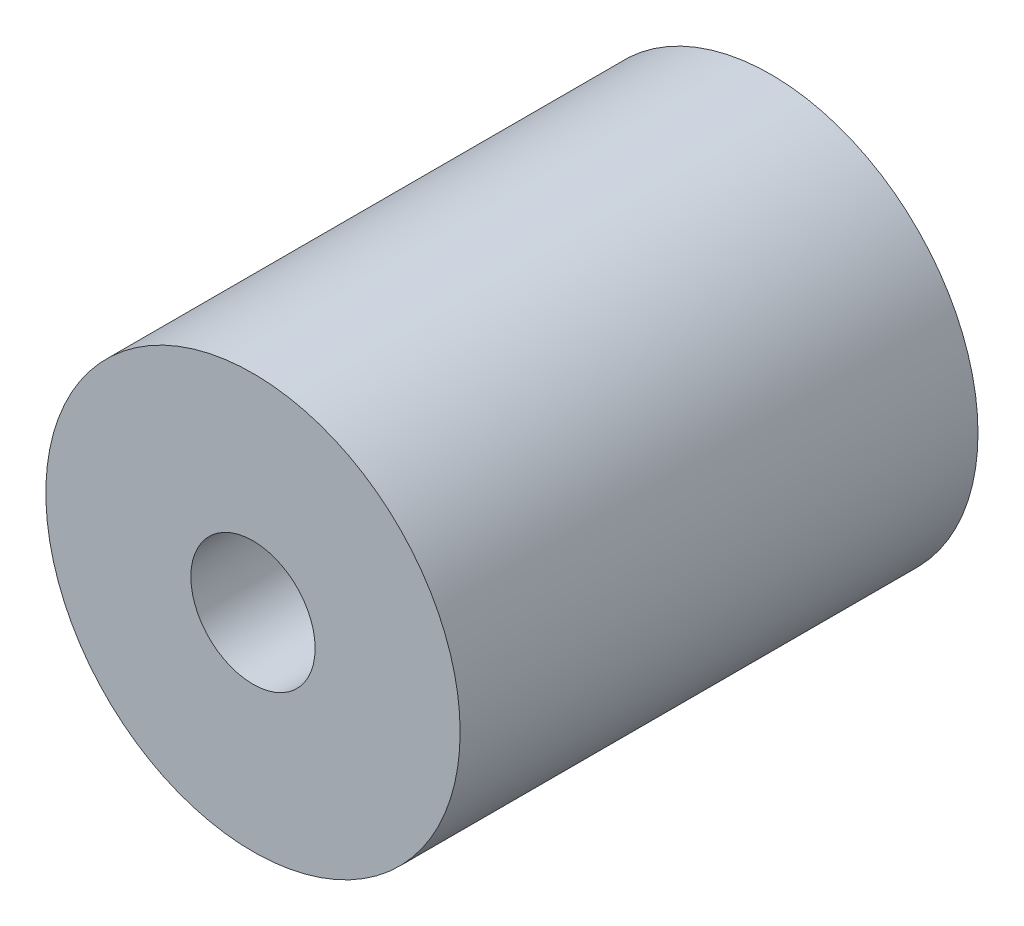
ISO-10303-21;
HEADER;
FILE_DESCRIPTION(('STEP AP214'),'2;1');
FILE_NAME('part.step','',(''),(''),'','','');
FILE_SCHEMA(('AUTOMOTIVE_DESIGN { 1 0 10303 214 1 1 1 1 }'));
ENDSEC;
DATA;
#1=APPLICATION_CONTEXT('core data for automotive mechanical design processes');
#2=APPLICATION_PROTOCOL_DEFINITION('international standard','automotive_design',2000,#1);
#3=PRODUCT_CONTEXT('',#1,'mechanical');
#4=PRODUCT('Part','Part','',(#3));
#5=PRODUCT_RELATED_PRODUCT_CATEGORY('part','',(#4));
#6=PRODUCT_DEFINITION_FORMATION('','',#4);
#7=PRODUCT_DEFINITION_CONTEXT('part definition',#1,'design');
#8=PRODUCT_DEFINITION('design','',#6,#7);
#9=PRODUCT_DEFINITION_SHAPE('','',#8);
#10=(LENGTH_UNIT() NAMED_UNIT(*) SI_UNIT(.MILLI.,.METRE.));
#11=(NAMED_UNIT(*) PLANE_ANGLE_UNIT() SI_UNIT($,.RADIAN.));
#12=(NAMED_UNIT(*) SI_UNIT($,.STERADIAN.) SOLID_ANGLE_UNIT());
#13=UNCERTAINTY_MEASURE_WITH_UNIT(LENGTH_MEASURE(1.E-05),#10,'distance_accuracy_value','');
#14=(GEOMETRIC_REPRESENTATION_CONTEXT(3) GLOBAL_UNCERTAINTY_ASSIGNED_CONTEXT((#13)) GLOBAL_UNIT_ASSIGNED_CONTEXT((#10,
#11,#12)) REPRESENTATION_CONTEXT('',''));
#15=CARTESIAN_POINT('',(0.,0.,0.));
#16=DIRECTION('',(0.,0.,1.));
#17=DIRECTION('',(1.,0.,0.));
#18=AXIS2_PLACEMENT_3D('',#15,#16,#17);
#19=CARTESIAN_POINT('',(0.,0.,25.));
#20=DIRECTION('',(0.,0.,-1.));
#21=DIRECTION('',(-1.,0.,0.));
#22=AXIS2_PLACEMENT_3D('',#19,#20,#21);
#23=CYLINDRICAL_SURFACE('',#22,3.);
#24=CARTESIAN_POINT('',(0.,0.,25.));
#25=DIRECTION('',(0.,0.,1.));
#26=DIRECTION('',(1.,0.,0.));
#27=AXIS2_PLACEMENT_3D('',#24,#25,#26);
#28=CIRCLE('',#27,3.);
#29=CARTESIAN_POINT('',(3.,0.,25.));
#30=VERTEX_POINT('',#29);
#31=EDGE_CURVE('E50',#30,#30,#28,.T.);
#32=ORIENTED_EDGE('',*,*,#31,.T.);
#33=EDGE_LOOP('',(#32));
#34=FACE_BOUND('',#33,.T.);
#35=CARTESIAN_POINT('',(0.,0.,10.));
#36=DIRECTION('',(0.,0.,-1.));
#37=DIRECTION('',(-1.,0.,0.));
#38=AXIS2_PLACEMENT_3D('',#35,#36,#37);
#39=CIRCLE('',#38,3.);
#40=CARTESIAN_POINT('',(-3.,0.,10.));
#41=VERTEX_POINT('',#40);
#42=EDGE_CURVE('E41',#41,#41,#39,.T.);
#43=ORIENTED_EDGE('',*,*,#42,.T.);
#44=EDGE_LOOP('',(#43));
#45=FACE_BOUND('',#44,.T.);
#46=ADVANCED_FACE('F37',(#34,#45),#23,.F.);
#47=CARTESIAN_POINT('',(0.,0.,25.));
#48=DIRECTION('',(0.,0.,1.));
#49=DIRECTION('',(1.,0.,0.));
#50=AXIS2_PLACEMENT_3D('',#47,#48,#49);
#51=PLANE('',#50);
#52=CARTESIAN_POINT('',(0.,0.,25.));
#53=DIRECTION('',(0.,0.,1.));
#54=DIRECTION('',(1.,0.,0.));
#55=AXIS2_PLACEMENT_3D('',#52,#53,#54);
#56=CIRCLE('',#55,10.);
#57=CARTESIAN_POINT('',(10.,0.,25.));
#58=VERTEX_POINT('',#57);
#59=EDGE_CURVE('E10',#58,#58,#56,.T.);
#60=ORIENTED_EDGE('',*,*,#59,.T.);
#61=EDGE_LOOP('',(#60));
#62=FACE_BOUND('',#61,.T.);
#63=ORIENTED_EDGE('',*,*,#31,.F.);
#64=EDGE_LOOP('',(#63));
#65=FACE_BOUND('',#64,.T.);
#66=ADVANCED_FACE('F75',(#62,#65),#51,.T.);
#67=CARTESIAN_POINT('',(0.,0.,0.));
#68=DIRECTION('',(0.,0.,1.));
#69=DIRECTION('',(1.,0.,0.));
#70=AXIS2_PLACEMENT_3D('',#67,#68,#69);
#71=PLANE('',#70);
#72=CARTESIAN_POINT('',(0.,0.,0.));
#73=DIRECTION('',(0.,0.,-1.));
#74=DIRECTION('',(-1.,0.,0.));
#75=AXIS2_PLACEMENT_3D('',#72,#73,#74);
#76=CIRCLE('',#75,4.);
#77=CARTESIAN_POINT('',(-4.,0.,0.));
#78=VERTEX_POINT('',#77);
#79=EDGE_CURVE('E54',#78,#78,#76,.T.);
#80=ORIENTED_EDGE('',*,*,#79,.F.);
#81=EDGE_LOOP('',(#80));
#82=FACE_BOUND('',#81,.T.);
#83=CARTESIAN_POINT('',(0.,0.,0.));
#84=DIRECTION('',(0.,0.,1.));
#85=DIRECTION('',(1.,0.,0.));
#86=AXIS2_PLACEMENT_3D('',#83,#84,#85);
#87=CIRCLE('',#86,10.);
#88=CARTESIAN_POINT('',(10.,0.,0.));
#89=VERTEX_POINT('',#88);
#90=EDGE_CURVE('E45',#89,#89,#87,.T.);
#91=ORIENTED_EDGE('',*,*,#90,.F.);
#92=EDGE_LOOP('',(#91));
#93=FACE_BOUND('',#92,.T.);
#94=ADVANCED_FACE('F81',(#82,#93),#71,.F.);
#95=CARTESIAN_POINT('',(0.,0.,25.));
#96=DIRECTION('',(0.,0.,-1.));
#97=DIRECTION('',(-1.,0.,0.));
#98=AXIS2_PLACEMENT_3D('',#95,#96,#97);
#99=CYLINDRICAL_SURFACE('',#98,10.);
#100=ORIENTED_EDGE('',*,*,#59,.F.);
#101=EDGE_LOOP('',(#100));
#102=FACE_BOUND('',#101,.T.);
#103=ORIENTED_EDGE('',*,*,#90,.T.);
#104=EDGE_LOOP('',(#103));
#105=FACE_BOUND('',#104,.T.);
#106=ADVANCED_FACE('F39',(#102,#105),#99,.T.);
#107=CARTESIAN_POINT('',(0.,0.,10.));
#108=DIRECTION('',(0.,0.,-1.));
#109=DIRECTION('',(-1.,0.,0.));
#110=AXIS2_PLACEMENT_3D('',#107,#108,#109);
#111=CYLINDRICAL_SURFACE('',#110,4.);
#112=CARTESIAN_POINT('',(0.,0.,10.));
#113=DIRECTION('',(0.,0.,-1.));
#114=DIRECTION('',(-1.,0.,0.));
#115=AXIS2_PLACEMENT_3D('',#112,#113,#114);
#116=CIRCLE('',#115,4.);
#117=CARTESIAN_POINT('',(-4.,0.,10.));
#118=VERTEX_POINT('',#117);
#119=EDGE_CURVE('E57',#118,#118,#116,.T.);
#120=ORIENTED_EDGE('',*,*,#119,.F.);
#121=EDGE_LOOP('',(#120));
#122=FACE_BOUND('',#121,.T.);
#123=ORIENTED_EDGE('',*,*,#79,.T.);
#124=EDGE_LOOP('',(#123));
#125=FACE_BOUND('',#124,.T.);
#126=ADVANCED_FACE('F67',(#122,#125),#111,.F.);
#127=CARTESIAN_POINT('',(0.,0.,10.));
#128=DIRECTION('',(0.,0.,-1.));
#129=DIRECTION('',(-1.,0.,0.));
#130=AXIS2_PLACEMENT_3D('',#127,#128,#129);
#131=PLANE('',#130);
#132=ORIENTED_EDGE('',*,*,#42,.F.);
#133=EDGE_LOOP('',(#132));
#134=FACE_BOUND('',#133,.T.);
#135=ORIENTED_EDGE('',*,*,#119,.T.);
#136=EDGE_LOOP('',(#135));
#137=FACE_BOUND('',#136,.T.);
#138=ADVANCED_FACE('F65',(#134,#137),#131,.T.);
#139=CLOSED_SHELL('',(#46,#66,#94,#106,#126,#138));
#140=MANIFOLD_SOLID_BREP('B2',#139);
#141=ADVANCED_BREP_SHAPE_REPRESENTATION('',(#18,#140),#14);
#142=SHAPE_DEFINITION_REPRESENTATION(#9,#141);
ENDSEC;
END-ISO-10303-21;
